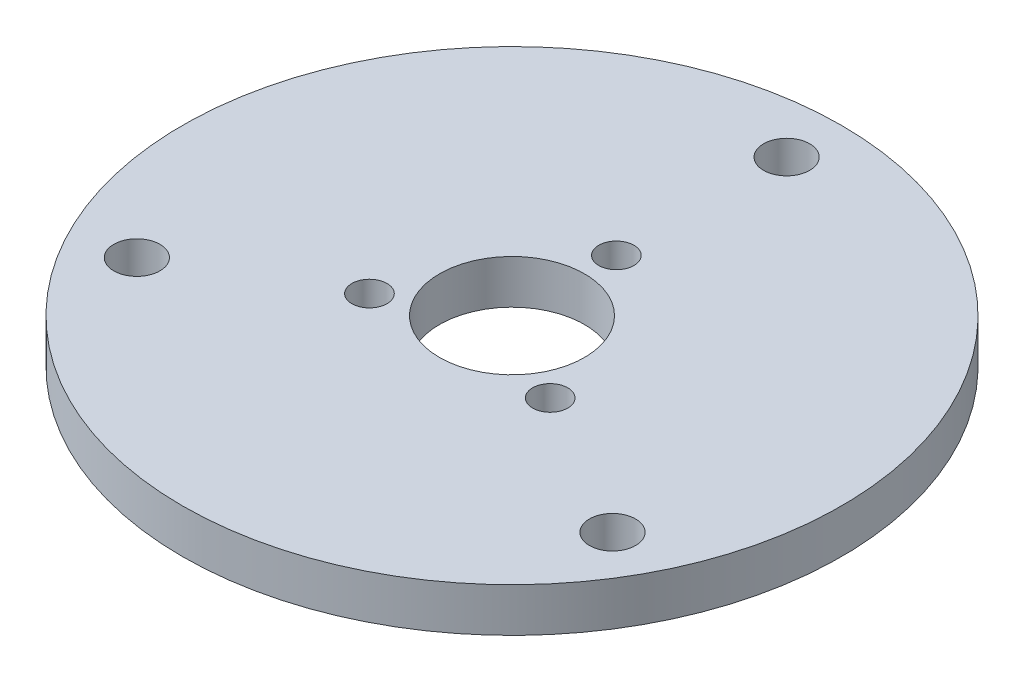
ISO-10303-21;
HEADER;
FILE_DESCRIPTION(('STEP AP214'),'2;1');
FILE_NAME('part.step','',(''),(''),'','','');
FILE_SCHEMA(('AUTOMOTIVE_DESIGN { 1 0 10303 214 1 1 1 1 }'));
ENDSEC;
DATA;
#1=APPLICATION_CONTEXT('core data for automotive mechanical design processes');
#2=APPLICATION_PROTOCOL_DEFINITION('international standard','automotive_design',2000,#1);
#3=PRODUCT_CONTEXT('',#1,'mechanical');
#4=PRODUCT('Part','Part','',(#3));
#5=PRODUCT_RELATED_PRODUCT_CATEGORY('part','',(#4));
#6=PRODUCT_DEFINITION_FORMATION('','',#4);
#7=PRODUCT_DEFINITION_CONTEXT('part definition',#1,'design');
#8=PRODUCT_DEFINITION('design','',#6,#7);
#9=PRODUCT_DEFINITION_SHAPE('','',#8);
#10=(LENGTH_UNIT() NAMED_UNIT(*) SI_UNIT(.MILLI.,.METRE.));
#11=(NAMED_UNIT(*) PLANE_ANGLE_UNIT() SI_UNIT($,.RADIAN.));
#12=(NAMED_UNIT(*) SI_UNIT($,.STERADIAN.) SOLID_ANGLE_UNIT());
#13=UNCERTAINTY_MEASURE_WITH_UNIT(LENGTH_MEASURE(1.E-05),#10,'distance_accuracy_value','');
#14=(GEOMETRIC_REPRESENTATION_CONTEXT(3) GLOBAL_UNCERTAINTY_ASSIGNED_CONTEXT((#13)) GLOBAL_UNIT_ASSIGNED_CONTEXT((#10,
#11,#12)) REPRESENTATION_CONTEXT('',''));
#15=CARTESIAN_POINT('',(0.,0.,0.));
#16=DIRECTION('',(0.,0.,1.));
#17=DIRECTION('',(1.,0.,0.));
#18=AXIS2_PLACEMENT_3D('',#15,#16,#17);
#19=CARTESIAN_POINT('',(0.,4.,0.));
#20=DIRECTION('',(0.,-1.,0.));
#21=DIRECTION('',(0.,0.,-1.));
#22=AXIS2_PLACEMENT_3D('',#19,#20,#21);
#23=CYLINDRICAL_SURFACE('',#22,30.);
#24=CARTESIAN_POINT('',(0.,4.,0.));
#25=DIRECTION('',(0.,1.,0.));
#26=DIRECTION('',(0.,0.,1.));
#27=AXIS2_PLACEMENT_3D('',#24,#25,#26);
#28=CIRCLE('',#27,30.);
#29=CARTESIAN_POINT('',(0.,4.,30.));
#30=VERTEX_POINT('',#29);
#31=EDGE_CURVE('E11',#30,#30,#28,.T.);
#32=ORIENTED_EDGE('',*,*,#31,.F.);
#33=EDGE_LOOP('',(#32));
#34=FACE_BOUND('',#33,.T.);
#35=CARTESIAN_POINT('',(0.,0.,0.));
#36=DIRECTION('',(0.,1.,0.));
#37=DIRECTION('',(0.,0.,1.));
#38=AXIS2_PLACEMENT_3D('',#35,#36,#37);
#39=CIRCLE('',#38,30.);
#40=CARTESIAN_POINT('',(0.,0.,30.));
#41=VERTEX_POINT('',#40);
#42=EDGE_CURVE('E67',#41,#41,#39,.T.);
#43=ORIENTED_EDGE('',*,*,#42,.T.);
#44=EDGE_LOOP('',(#43));
#45=FACE_BOUND('',#44,.T.);
#46=ADVANCED_FACE('F60',(#34,#45),#23,.T.);
#47=CARTESIAN_POINT('',(0.,4.,0.));
#48=DIRECTION('',(0.,1.,0.));
#49=DIRECTION('',(0.,0.,1.));
#50=AXIS2_PLACEMENT_3D('',#47,#48,#49);
#51=PLANE('',#50);
#52=CARTESIAN_POINT('',(-8.22724133595214,4.,4.75000000000004));
#53=DIRECTION('',(0.,1.,0.));
#54=DIRECTION('',(-0.866025403784443,0.,-0.499999999999992));
#55=AXIS2_PLACEMENT_3D('',#52,#53,#54);
#56=CIRCLE('',#55,1.6);
#57=CARTESIAN_POINT('',(-9.61288198200725,4.,3.95000000000005));
#58=VERTEX_POINT('',#57);
#59=EDGE_CURVE('E93',#58,#58,#56,.T.);
#60=ORIENTED_EDGE('',*,*,#59,.F.);
#61=EDGE_LOOP('',(#60));
#62=FACE_BOUND('',#61,.T.);
#63=CARTESIAN_POINT('',(0.,4.,-9.5));
#64=DIRECTION('',(0.,1.,0.));
#65=DIRECTION('',(0.866025403784436,0.,-0.500000000000004));
#66=AXIS2_PLACEMENT_3D('',#63,#64,#65);
#67=CIRCLE('',#66,1.6);
#68=CARTESIAN_POINT('',(1.3856406460551,4.,-10.3));
#69=VERTEX_POINT('',#68);
#70=EDGE_CURVE('E88',#69,#69,#67,.T.);
#71=ORIENTED_EDGE('',*,*,#70,.F.);
#72=EDGE_LOOP('',(#71));
#73=FACE_BOUND('',#72,.T.);
#74=CARTESIAN_POINT('',(8.22724133595215,4.,4.75000000000004));
#75=DIRECTION('',(0.,1.,0.));
#76=DIRECTION('',(0.,0.,1.));
#77=AXIS2_PLACEMENT_3D('',#74,#75,#76);
#78=CIRCLE('',#77,1.6);
#79=CARTESIAN_POINT('',(8.22724133595215,4.,6.35000000000004));
#80=VERTEX_POINT('',#79);
#81=EDGE_CURVE('E85',#80,#80,#78,.T.);
#82=ORIENTED_EDGE('',*,*,#81,.F.);
#83=EDGE_LOOP('',(#82));
#84=FACE_BOUND('',#83,.T.);
#85=CARTESIAN_POINT('',(0.,4.,0.));
#86=DIRECTION('',(0.,1.,0.));
#87=DIRECTION('',(0.,0.,1.));
#88=AXIS2_PLACEMENT_3D('',#85,#86,#87);
#89=CIRCLE('',#88,6.6);
#90=CARTESIAN_POINT('',(0.,4.,6.6));
#91=VERTEX_POINT('',#90);
#92=EDGE_CURVE('E82',#91,#91,#89,.T.);
#93=ORIENTED_EDGE('',*,*,#92,.F.);
#94=EDGE_LOOP('',(#93));
#95=FACE_BOUND('',#94,.T.);
#96=CARTESIAN_POINT('',(21.6506350946109,4.,12.5000000000001));
#97=DIRECTION('',(0.,1.,0.));
#98=DIRECTION('',(-0.866025403784436,0.,-0.500000000000004));
#99=AXIS2_PLACEMENT_3D('',#96,#97,#98);
#100=CIRCLE('',#99,2.1);
#101=CARTESIAN_POINT('',(19.8319817466636,4.,11.4500000000001));
#102=VERTEX_POINT('',#101);
#103=EDGE_CURVE('E107',#102,#102,#100,.T.);
#104=ORIENTED_EDGE('',*,*,#103,.F.);
#105=EDGE_LOOP('',(#104));
#106=FACE_BOUND('',#105,.T.);
#107=CARTESIAN_POINT('',(-21.6506350946111,4.,12.4999999999998));
#108=DIRECTION('',(0.,1.,0.));
#109=DIRECTION('',(0.866025403784443,0.,-0.499999999999992));
#110=AXIS2_PLACEMENT_3D('',#107,#108,#109);
#111=CIRCLE('',#110,2.1);
#112=CARTESIAN_POINT('',(-19.8319817466638,4.,11.4499999999998));
#113=VERTEX_POINT('',#112);
#114=EDGE_CURVE('E81',#113,#113,#111,.T.);
#115=ORIENTED_EDGE('',*,*,#114,.F.);
#116=EDGE_LOOP('',(#115));
#117=FACE_BOUND('',#116,.T.);
#118=CARTESIAN_POINT('',(0.,4.,-25.));
#119=DIRECTION('',(0.,1.,0.));
#120=DIRECTION('',(0.,0.,1.));
#121=AXIS2_PLACEMENT_3D('',#118,#119,#120);
#122=CIRCLE('',#121,2.1);
#123=CARTESIAN_POINT('',(0.,4.,-22.9));
#124=VERTEX_POINT('',#123);
#125=EDGE_CURVE('E75',#124,#124,#122,.T.);
#126=ORIENTED_EDGE('',*,*,#125,.F.);
#127=EDGE_LOOP('',(#126));
#128=FACE_BOUND('',#127,.T.);
#129=ORIENTED_EDGE('',*,*,#31,.T.);
#130=EDGE_LOOP('',(#129));
#131=FACE_BOUND('',#130,.T.);
#132=ADVANCED_FACE('F122',(#62,#73,#84,#95,#106,#117,#128,#131),#51,.T.);
#133=CARTESIAN_POINT('',(0.,0.,0.));
#134=DIRECTION('',(0.,1.,0.));
#135=DIRECTION('',(0.,0.,1.));
#136=AXIS2_PLACEMENT_3D('',#133,#134,#135);
#137=PLANE('',#136);
#138=CARTESIAN_POINT('',(-8.22724133595214,0.,4.75000000000004));
#139=DIRECTION('',(0.,1.,0.));
#140=DIRECTION('',(0.,0.,1.));
#141=AXIS2_PLACEMENT_3D('',#138,#139,#140);
#142=CIRCLE('',#141,1.6);
#143=CARTESIAN_POINT('',(-8.22724133595214,0.,6.35000000000004));
#144=VERTEX_POINT('',#143);
#145=EDGE_CURVE('E63',#144,#144,#142,.T.);
#146=ORIENTED_EDGE('',*,*,#145,.T.);
#147=EDGE_LOOP('',(#146));
#148=FACE_BOUND('',#147,.T.);
#149=CARTESIAN_POINT('',(0.,0.,-9.5));
#150=DIRECTION('',(0.,1.,0.));
#151=DIRECTION('',(0.,0.,1.));
#152=AXIS2_PLACEMENT_3D('',#149,#150,#151);
#153=CIRCLE('',#152,1.6);
#154=CARTESIAN_POINT('',(0.,0.,-7.9));
#155=VERTEX_POINT('',#154);
#156=EDGE_CURVE('E86',#155,#155,#153,.T.);
#157=ORIENTED_EDGE('',*,*,#156,.T.);
#158=EDGE_LOOP('',(#157));
#159=FACE_BOUND('',#158,.T.);
#160=CARTESIAN_POINT('',(8.22724133595215,0.,4.75000000000004));
#161=DIRECTION('',(0.,1.,0.));
#162=DIRECTION('',(0.,0.,1.));
#163=AXIS2_PLACEMENT_3D('',#160,#161,#162);
#164=CIRCLE('',#163,1.6);
#165=CARTESIAN_POINT('',(8.22724133595215,0.,6.35000000000004));
#166=VERTEX_POINT('',#165);
#167=EDGE_CURVE('E83',#166,#166,#164,.T.);
#168=ORIENTED_EDGE('',*,*,#167,.T.);
#169=EDGE_LOOP('',(#168));
#170=FACE_BOUND('',#169,.T.);
#171=CARTESIAN_POINT('',(0.,0.,0.));
#172=DIRECTION('',(0.,1.,0.));
#173=DIRECTION('',(0.,0.,1.));
#174=AXIS2_PLACEMENT_3D('',#171,#172,#173);
#175=CIRCLE('',#174,6.6);
#176=CARTESIAN_POINT('',(0.,0.,6.6));
#177=VERTEX_POINT('',#176);
#178=EDGE_CURVE('E78',#177,#177,#175,.T.);
#179=ORIENTED_EDGE('',*,*,#178,.T.);
#180=EDGE_LOOP('',(#179));
#181=FACE_BOUND('',#180,.T.);
#182=CARTESIAN_POINT('',(21.6506350946109,0.,12.5000000000001));
#183=DIRECTION('',(0.,1.,0.));
#184=DIRECTION('',(-0.866025403784436,0.,-0.500000000000004));
#185=AXIS2_PLACEMENT_3D('',#182,#183,#184);
#186=CIRCLE('',#185,2.1);
#187=CARTESIAN_POINT('',(19.8319817466636,0.,11.4500000000001));
#188=VERTEX_POINT('',#187);
#189=EDGE_CURVE('E104',#188,#188,#186,.T.);
#190=ORIENTED_EDGE('',*,*,#189,.T.);
#191=EDGE_LOOP('',(#190));
#192=FACE_BOUND('',#191,.T.);
#193=CARTESIAN_POINT('',(-21.6506350946111,0.,12.4999999999998));
#194=DIRECTION('',(0.,1.,0.));
#195=DIRECTION('',(0.866025403784443,0.,-0.499999999999992));
#196=AXIS2_PLACEMENT_3D('',#193,#194,#195);
#197=CIRCLE('',#196,2.1);
#198=CARTESIAN_POINT('',(-19.8319817466638,0.,11.4499999999998));
#199=VERTEX_POINT('',#198);
#200=EDGE_CURVE('E110',#199,#199,#197,.T.);
#201=ORIENTED_EDGE('',*,*,#200,.T.);
#202=EDGE_LOOP('',(#201));
#203=FACE_BOUND('',#202,.T.);
#204=CARTESIAN_POINT('',(0.,0.,-25.));
#205=DIRECTION('',(0.,1.,0.));
#206=DIRECTION('',(0.,0.,1.));
#207=AXIS2_PLACEMENT_3D('',#204,#205,#206);
#208=CIRCLE('',#207,2.1);
#209=CARTESIAN_POINT('',(0.,0.,-22.9));
#210=VERTEX_POINT('',#209);
#211=EDGE_CURVE('E72',#210,#210,#208,.T.);
#212=ORIENTED_EDGE('',*,*,#211,.T.);
#213=EDGE_LOOP('',(#212));
#214=FACE_BOUND('',#213,.T.);
#215=ORIENTED_EDGE('',*,*,#42,.F.);
#216=EDGE_LOOP('',(#215));
#217=FACE_BOUND('',#216,.T.);
#218=ADVANCED_FACE('F124',(#148,#159,#170,#181,#192,#203,#214,#217),#137,.F.);
#219=CARTESIAN_POINT('',(0.,0.,-25.));
#220=DIRECTION('',(0.,1.,0.));
#221=DIRECTION('',(0.,0.,1.));
#222=AXIS2_PLACEMENT_3D('',#219,#220,#221);
#223=CYLINDRICAL_SURFACE('',#222,2.1);
#224=ORIENTED_EDGE('',*,*,#211,.F.);
#225=EDGE_LOOP('',(#224));
#226=FACE_BOUND('',#225,.T.);
#227=ORIENTED_EDGE('',*,*,#125,.T.);
#228=EDGE_LOOP('',(#227));
#229=FACE_BOUND('',#228,.T.);
#230=ADVANCED_FACE('F120',(#226,#229),#223,.F.);
#231=CARTESIAN_POINT('',(-21.6506350946111,0.,12.4999999999998));
#232=DIRECTION('',(0.,1.,0.));
#233=DIRECTION('',(0.,0.,1.));
#234=AXIS2_PLACEMENT_3D('',#231,#232,#233);
#235=CYLINDRICAL_SURFACE('',#234,2.1);
#236=ORIENTED_EDGE('',*,*,#200,.F.);
#237=EDGE_LOOP('',(#236));
#238=FACE_BOUND('',#237,.T.);
#239=ORIENTED_EDGE('',*,*,#114,.T.);
#240=EDGE_LOOP('',(#239));
#241=FACE_BOUND('',#240,.T.);
#242=ADVANCED_FACE('F138',(#238,#241),#235,.F.);
#243=CARTESIAN_POINT('',(21.6506350946109,0.,12.5000000000001));
#244=DIRECTION('',(0.,1.,0.));
#245=DIRECTION('',(0.,0.,1.));
#246=AXIS2_PLACEMENT_3D('',#243,#244,#245);
#247=CYLINDRICAL_SURFACE('',#246,2.1);
#248=ORIENTED_EDGE('',*,*,#189,.F.);
#249=EDGE_LOOP('',(#248));
#250=FACE_BOUND('',#249,.T.);
#251=ORIENTED_EDGE('',*,*,#103,.T.);
#252=EDGE_LOOP('',(#251));
#253=FACE_BOUND('',#252,.T.);
#254=ADVANCED_FACE('F142',(#250,#253),#247,.F.);
#255=CARTESIAN_POINT('',(0.,-13.,0.));
#256=DIRECTION('',(0.,1.,0.));
#257=DIRECTION('',(0.,0.,1.));
#258=AXIS2_PLACEMENT_3D('',#255,#256,#257);
#259=CYLINDRICAL_SURFACE('',#258,6.6);
#260=ORIENTED_EDGE('',*,*,#92,.T.);
#261=EDGE_LOOP('',(#260));
#262=FACE_BOUND('',#261,.T.);
#263=ORIENTED_EDGE('',*,*,#178,.F.);
#264=EDGE_LOOP('',(#263));
#265=FACE_BOUND('',#264,.T.);
#266=ADVANCED_FACE('F146',(#262,#265),#259,.F.);
#267=CARTESIAN_POINT('',(8.22724133595215,-13.,4.75000000000004));
#268=DIRECTION('',(0.,1.,0.));
#269=DIRECTION('',(0.,0.,1.));
#270=AXIS2_PLACEMENT_3D('',#267,#268,#269);
#271=CYLINDRICAL_SURFACE('',#270,1.6);
#272=ORIENTED_EDGE('',*,*,#81,.T.);
#273=EDGE_LOOP('',(#272));
#274=FACE_BOUND('',#273,.T.);
#275=ORIENTED_EDGE('',*,*,#167,.F.);
#276=EDGE_LOOP('',(#275));
#277=FACE_BOUND('',#276,.T.);
#278=ADVANCED_FACE('F150',(#274,#277),#271,.F.);
#279=CARTESIAN_POINT('',(0.,-13.,-9.5));
#280=DIRECTION('',(0.,1.,0.));
#281=DIRECTION('',(0.,0.,1.));
#282=AXIS2_PLACEMENT_3D('',#279,#280,#281);
#283=CYLINDRICAL_SURFACE('',#282,1.6);
#284=ORIENTED_EDGE('',*,*,#70,.T.);
#285=EDGE_LOOP('',(#284));
#286=FACE_BOUND('',#285,.T.);
#287=ORIENTED_EDGE('',*,*,#156,.F.);
#288=EDGE_LOOP('',(#287));
#289=FACE_BOUND('',#288,.T.);
#290=ADVANCED_FACE('F154',(#286,#289),#283,.F.);
#291=CARTESIAN_POINT('',(-8.22724133595214,-13.,4.75000000000004));
#292=DIRECTION('',(0.,1.,0.));
#293=DIRECTION('',(0.,0.,1.));
#294=AXIS2_PLACEMENT_3D('',#291,#292,#293);
#295=CYLINDRICAL_SURFACE('',#294,1.6);
#296=ORIENTED_EDGE('',*,*,#59,.T.);
#297=EDGE_LOOP('',(#296));
#298=FACE_BOUND('',#297,.T.);
#299=ORIENTED_EDGE('',*,*,#145,.F.);
#300=EDGE_LOOP('',(#299));
#301=FACE_BOUND('',#300,.T.);
#302=ADVANCED_FACE('F158',(#298,#301),#295,.F.);
#303=CLOSED_SHELL('',(#46,#132,#218,#230,#242,#254,#266,#278,#290,#302));
#304=MANIFOLD_SOLID_BREP('B2',#303);
#305=ADVANCED_BREP_SHAPE_REPRESENTATION('',(#18,#304),#14);
#306=SHAPE_DEFINITION_REPRESENTATION(#9,#305);
ENDSEC;
END-ISO-10303-21;
